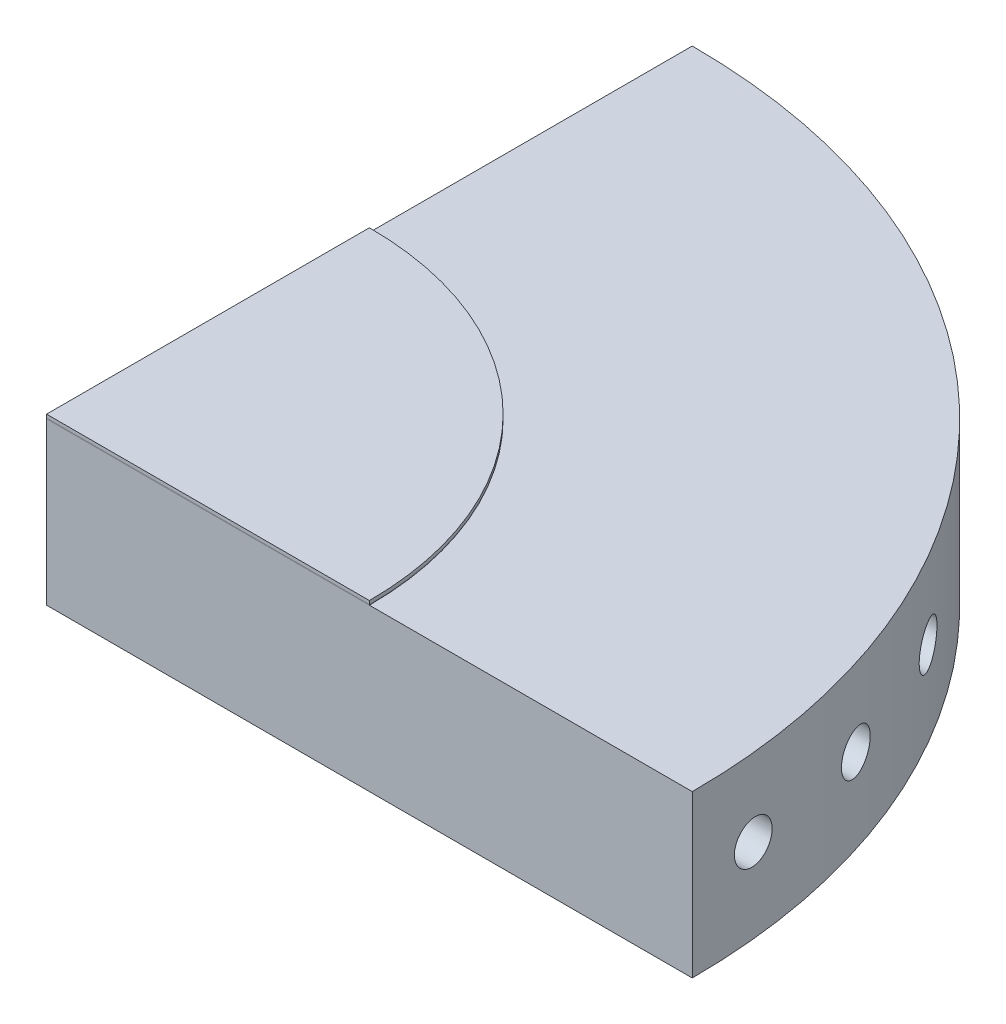
ISO-10303-21;
HEADER;
FILE_DESCRIPTION(('STEP AP214'),'2;1');
FILE_NAME('part.step','',(''),(''),'','','');
FILE_SCHEMA(('AUTOMOTIVE_DESIGN { 1 0 10303 214 1 1 1 1 }'));
ENDSEC;
DATA;
#1=APPLICATION_CONTEXT('core data for automotive mechanical design processes');
#2=APPLICATION_PROTOCOL_DEFINITION('international standard','automotive_design',2000,#1);
#3=PRODUCT_CONTEXT('',#1,'mechanical');
#4=PRODUCT('Part','Part','',(#3));
#5=PRODUCT_RELATED_PRODUCT_CATEGORY('part','',(#4));
#6=PRODUCT_DEFINITION_FORMATION('','',#4);
#7=PRODUCT_DEFINITION_CONTEXT('part definition',#1,'design');
#8=PRODUCT_DEFINITION('design','',#6,#7);
#9=PRODUCT_DEFINITION_SHAPE('','',#8);
#10=(LENGTH_UNIT() NAMED_UNIT(*) SI_UNIT(.MILLI.,.METRE.));
#11=(NAMED_UNIT(*) PLANE_ANGLE_UNIT() SI_UNIT($,.RADIAN.));
#12=(NAMED_UNIT(*) SI_UNIT($,.STERADIAN.) SOLID_ANGLE_UNIT());
#13=UNCERTAINTY_MEASURE_WITH_UNIT(LENGTH_MEASURE(1.E-05),#10,'distance_accuracy_value','');
#14=(GEOMETRIC_REPRESENTATION_CONTEXT(3) GLOBAL_UNCERTAINTY_ASSIGNED_CONTEXT((#13)) GLOBAL_UNIT_ASSIGNED_CONTEXT((#10,
#11,#12)) REPRESENTATION_CONTEXT('',''));
#15=CARTESIAN_POINT('',(0.,0.,0.));
#16=DIRECTION('',(0.,0.,1.));
#17=DIRECTION('',(1.,0.,0.));
#18=AXIS2_PLACEMENT_3D('',#15,#16,#17);
#19=CARTESIAN_POINT('',(0.,25.625,0.));
#20=DIRECTION('',(0.,-1.,0.));
#21=DIRECTION('',(0.,0.,-1.));
#22=AXIS2_PLACEMENT_3D('',#19,#20,#21);
#23=CYLINDRICAL_SURFACE('',#22,50.);
#24=DIRECTION('',(0.,-1.,0.));
#25=VECTOR('',#24,1.);
#26=CARTESIAN_POINT('',(0.,25.625,-50.));
#27=LINE('',#26,#25);
#28=CARTESIAN_POINT('',(0.,25.625,-50.));
#29=VERTEX_POINT('',#28);
#30=CARTESIAN_POINT('',(0.,25.1,-50.));
#31=VERTEX_POINT('',#30);
#32=EDGE_CURVE('E73',#29,#31,#27,.T.);
#33=ORIENTED_EDGE('',*,*,#32,.F.);
#34=CARTESIAN_POINT('',(0.,25.625,0.));
#35=DIRECTION('',(0.,1.,0.));
#36=DIRECTION('',(0.,0.,1.));
#37=AXIS2_PLACEMENT_3D('',#34,#35,#36);
#38=CIRCLE('',#37,50.);
#39=CARTESIAN_POINT('',(50.,25.625,0.));
#40=VERTEX_POINT('',#39);
#41=EDGE_CURVE('E98',#40,#29,#38,.T.);
#42=ORIENTED_EDGE('',*,*,#41,.F.);
#43=DIRECTION('',(0.,-1.,0.));
#44=VECTOR('',#43,1.);
#45=CARTESIAN_POINT('',(50.,25.625,0.));
#46=LINE('',#45,#44);
#47=CARTESIAN_POINT('',(50.,25.1,0.));
#48=VERTEX_POINT('',#47);
#49=EDGE_CURVE('E87',#48,#40,#46,.F.);
#50=ORIENTED_EDGE('',*,*,#49,.F.);
#51=CARTESIAN_POINT('',(0.,25.1,0.));
#52=DIRECTION('',(0.,1.,0.));
#53=DIRECTION('',(0.,0.,1.));
#54=AXIS2_PLACEMENT_3D('',#51,#52,#53);
#55=CIRCLE('',#54,50.);
#56=EDGE_CURVE('E103',#48,#31,#55,.T.);
#57=ORIENTED_EDGE('',*,*,#56,.T.);
#58=EDGE_LOOP('',(#33,#42,#50,#57));
#59=FACE_BOUND('',#58,.T.);
#60=ADVANCED_FACE('F53',(#59),#23,.T.);
#61=CARTESIAN_POINT('',(0.,25.625,0.));
#62=DIRECTION('',(0.,1.,0.));
#63=DIRECTION('',(0.,0.,1.));
#64=AXIS2_PLACEMENT_3D('',#61,#62,#63);
#65=PLANE('',#64);
#66=ORIENTED_EDGE('',*,*,#41,.T.);
#67=DIRECTION('',(0.,0.,-1.));
#68=VECTOR('',#67,1.);
#69=CARTESIAN_POINT('',(0.,25.625,0.));
#70=LINE('',#69,#68);
#71=CARTESIAN_POINT('',(0.,25.625,0.));
#72=VERTEX_POINT('',#71);
#73=EDGE_CURVE('E92',#72,#29,#70,.T.);
#74=ORIENTED_EDGE('',*,*,#73,.F.);
#75=DIRECTION('',(-1.,0.,0.));
#76=VECTOR('',#75,1.);
#77=CARTESIAN_POINT('',(0.,25.625,0.));
#78=LINE('',#77,#76);
#79=EDGE_CURVE('E84',#40,#72,#78,.T.);
#80=ORIENTED_EDGE('',*,*,#79,.F.);
#81=EDGE_LOOP('',(#66,#74,#80));
#82=FACE_BOUND('',#81,.T.);
#83=ADVANCED_FACE('F97',(#82),#65,.T.);
#84=CARTESIAN_POINT('',(0.,25.1,0.));
#85=DIRECTION('',(0.,1.,0.));
#86=DIRECTION('',(0.,0.,1.));
#87=AXIS2_PLACEMENT_3D('',#84,#85,#86);
#88=PLANE('',#87);
#89=DIRECTION('',(0.,0.,1.));
#90=VECTOR('',#89,1.);
#91=CARTESIAN_POINT('',(0.,25.1,0.));
#92=LINE('',#91,#90);
#93=CARTESIAN_POINT('',(0.,25.1,0.));
#94=VERTEX_POINT('',#93);
#95=EDGE_CURVE('E13',#31,#94,#92,.T.);
#96=ORIENTED_EDGE('',*,*,#95,.F.);
#97=ORIENTED_EDGE('',*,*,#56,.F.);
#98=DIRECTION('',(1.,0.,0.));
#99=VECTOR('',#98,1.);
#100=CARTESIAN_POINT('',(0.,25.1,0.));
#101=LINE('',#100,#99);
#102=EDGE_CURVE('E60',#94,#48,#101,.T.);
#103=ORIENTED_EDGE('',*,*,#102,.F.);
#104=EDGE_LOOP('',(#96,#97,#103));
#105=FACE_BOUND('',#104,.T.);
#106=ADVANCED_FACE('F109',(#105),#88,.F.);
#107=CARTESIAN_POINT('',(0.,25.625,0.));
#108=DIRECTION('',(-1.,0.,0.));
#109=DIRECTION('',(0.,0.,1.));
#110=AXIS2_PLACEMENT_3D('',#107,#108,#109);
#111=PLANE('',#110);
#112=ORIENTED_EDGE('',*,*,#32,.T.);
#113=ORIENTED_EDGE('',*,*,#95,.T.);
#114=DIRECTION('',(0.,-1.,0.));
#115=VECTOR('',#114,1.);
#116=CARTESIAN_POINT('',(0.,25.625,0.));
#117=LINE('',#116,#115);
#118=EDGE_CURVE('E67',#72,#94,#117,.T.);
#119=ORIENTED_EDGE('',*,*,#118,.F.);
#120=ORIENTED_EDGE('',*,*,#73,.T.);
#121=EDGE_LOOP('',(#112,#113,#119,#120));
#122=FACE_BOUND('',#121,.T.);
#123=ADVANCED_FACE('F94',(#122),#111,.T.);
#124=CARTESIAN_POINT('',(0.,25.625,0.));
#125=DIRECTION('',(0.,0.,1.));
#126=DIRECTION('',(1.,0.,0.));
#127=AXIS2_PLACEMENT_3D('',#124,#125,#126);
#128=PLANE('',#127);
#129=ORIENTED_EDGE('',*,*,#49,.T.);
#130=ORIENTED_EDGE('',*,*,#79,.T.);
#131=ORIENTED_EDGE('',*,*,#118,.T.);
#132=ORIENTED_EDGE('',*,*,#102,.T.);
#133=EDGE_LOOP('',(#129,#130,#131,#132));
#134=FACE_BOUND('',#133,.T.);
#135=ADVANCED_FACE('F85',(#134),#128,.T.);
#136=CLOSED_SHELL('',(#60,#83,#106,#123,#135));
#137=MANIFOLD_SOLID_BREP('B2',#136);
#138=CARTESIAN_POINT('',(0.,25.1,0.));
#139=DIRECTION('',(0.,-1.,0.));
#140=DIRECTION('',(0.,0.,-1.));
#141=AXIS2_PLACEMENT_3D('',#138,#139,#140);
#142=CYLINDRICAL_SURFACE('',#141,50.);
#143=DIRECTION('',(0.,-1.,0.));
#144=VECTOR('',#143,1.);
#145=CARTESIAN_POINT('',(0.,25.1,-50.));
#146=LINE('',#145,#144);
#147=CARTESIAN_POINT('',(0.,25.1,-50.));
#148=VERTEX_POINT('',#147);
#149=CARTESIAN_POINT('',(0.,25.,-50.));
#150=VERTEX_POINT('',#149);
#151=EDGE_CURVE('E198',#148,#150,#146,.T.);
#152=ORIENTED_EDGE('',*,*,#151,.F.);
#153=CARTESIAN_POINT('',(0.,25.1,0.));
#154=DIRECTION('',(0.,1.,0.));
#155=DIRECTION('',(0.,0.,1.));
#156=AXIS2_PLACEMENT_3D('',#153,#154,#155);
#157=CIRCLE('',#156,50.);
#158=CARTESIAN_POINT('',(50.,25.1,0.));
#159=VERTEX_POINT('',#158);
#160=EDGE_CURVE('E205',#159,#148,#157,.T.);
#161=ORIENTED_EDGE('',*,*,#160,.F.);
#162=DIRECTION('',(0.,-1.,0.));
#163=VECTOR('',#162,1.);
#164=CARTESIAN_POINT('',(50.,25.1,0.));
#165=LINE('',#164,#163);
#166=CARTESIAN_POINT('',(50.,25.,0.));
#167=VERTEX_POINT('',#166);
#168=EDGE_CURVE('E194',#167,#159,#165,.F.);
#169=ORIENTED_EDGE('',*,*,#168,.F.);
#170=CARTESIAN_POINT('',(0.,25.,0.));
#171=DIRECTION('',(0.,1.,0.));
#172=DIRECTION('',(0.,0.,1.));
#173=AXIS2_PLACEMENT_3D('',#170,#171,#172);
#174=CIRCLE('',#173,50.);
#175=EDGE_CURVE('E206',#167,#150,#174,.T.);
#176=ORIENTED_EDGE('',*,*,#175,.T.);
#177=EDGE_LOOP('',(#152,#161,#169,#176));
#178=FACE_BOUND('',#177,.T.);
#179=ADVANCED_FACE('F160',(#178),#142,.T.);
#180=CARTESIAN_POINT('',(0.,25.1,0.));
#181=DIRECTION('',(0.,1.,0.));
#182=DIRECTION('',(0.,0.,1.));
#183=AXIS2_PLACEMENT_3D('',#180,#181,#182);
#184=PLANE('',#183);
#185=ORIENTED_EDGE('',*,*,#160,.T.);
#186=DIRECTION('',(0.,0.,1.));
#187=VECTOR('',#186,1.);
#188=CARTESIAN_POINT('',(0.,25.1,0.));
#189=LINE('',#188,#187);
#190=CARTESIAN_POINT('',(0.,25.1,0.));
#191=VERTEX_POINT('',#190);
#192=EDGE_CURVE('E180',#148,#191,#189,.T.);
#193=ORIENTED_EDGE('',*,*,#192,.T.);
#194=DIRECTION('',(1.,0.,0.));
#195=VECTOR('',#194,1.);
#196=CARTESIAN_POINT('',(0.,25.1,0.));
#197=LINE('',#196,#195);
#198=EDGE_CURVE('E191',#191,#159,#197,.T.);
#199=ORIENTED_EDGE('',*,*,#198,.T.);
#200=EDGE_LOOP('',(#185,#193,#199));
#201=FACE_BOUND('',#200,.T.);
#202=ADVANCED_FACE('F204',(#201),#184,.T.);
#203=CARTESIAN_POINT('',(0.,25.,0.));
#204=DIRECTION('',(0.,1.,0.));
#205=DIRECTION('',(0.,0.,1.));
#206=AXIS2_PLACEMENT_3D('',#203,#204,#205);
#207=PLANE('',#206);
#208=DIRECTION('',(0.,0.,1.));
#209=VECTOR('',#208,1.);
#210=CARTESIAN_POINT('',(0.,25.,0.));
#211=LINE('',#210,#209);
#212=CARTESIAN_POINT('',(0.,25.,0.));
#213=VERTEX_POINT('',#212);
#214=EDGE_CURVE('E51',#150,#213,#211,.T.);
#215=ORIENTED_EDGE('',*,*,#214,.F.);
#216=ORIENTED_EDGE('',*,*,#175,.F.);
#217=DIRECTION('',(1.,0.,0.));
#218=VECTOR('',#217,1.);
#219=CARTESIAN_POINT('',(0.,25.,0.));
#220=LINE('',#219,#218);
#221=EDGE_CURVE('E167',#213,#167,#220,.T.);
#222=ORIENTED_EDGE('',*,*,#221,.F.);
#223=EDGE_LOOP('',(#215,#216,#222));
#224=FACE_BOUND('',#223,.T.);
#225=ADVANCED_FACE('F216',(#224),#207,.F.);
#226=CARTESIAN_POINT('',(0.,25.625,0.));
#227=DIRECTION('',(-1.,0.,0.));
#228=DIRECTION('',(0.,0.,1.));
#229=AXIS2_PLACEMENT_3D('',#226,#227,#228);
#230=PLANE('',#229);
#231=ORIENTED_EDGE('',*,*,#151,.T.);
#232=ORIENTED_EDGE('',*,*,#214,.T.);
#233=DIRECTION('',(0.,-1.,0.));
#234=VECTOR('',#233,1.);
#235=CARTESIAN_POINT('',(0.,25.625,0.));
#236=LINE('',#235,#234);
#237=EDGE_CURVE('E174',#191,#213,#236,.T.);
#238=ORIENTED_EDGE('',*,*,#237,.F.);
#239=ORIENTED_EDGE('',*,*,#192,.F.);
#240=EDGE_LOOP('',(#231,#232,#238,#239));
#241=FACE_BOUND('',#240,.T.);
#242=ADVANCED_FACE('F200',(#241),#230,.T.);
#243=CARTESIAN_POINT('',(0.,25.625,0.));
#244=DIRECTION('',(0.,0.,1.));
#245=DIRECTION('',(1.,0.,0.));
#246=AXIS2_PLACEMENT_3D('',#243,#244,#245);
#247=PLANE('',#246);
#248=ORIENTED_EDGE('',*,*,#237,.T.);
#249=ORIENTED_EDGE('',*,*,#221,.T.);
#250=ORIENTED_EDGE('',*,*,#168,.T.);
#251=ORIENTED_EDGE('',*,*,#198,.F.);
#252=EDGE_LOOP('',(#248,#249,#250,#251));
#253=FACE_BOUND('',#252,.T.);
#254=ADVANCED_FACE('F192',(#253),#247,.T.);
#255=CLOSED_SHELL('',(#179,#202,#225,#242,#254));
#256=MANIFOLD_SOLID_BREP('B7',#255);
#257=CARTESIAN_POINT('',(0.,0.,0.));
#258=DIRECTION('',(0.,1.,0.));
#259=DIRECTION('',(0.,0.,1.));
#260=AXIS2_PLACEMENT_3D('',#257,#258,#259);
#261=PLANE('',#260);
#262=CARTESIAN_POINT('',(25.,0.,-25.));
#263=DIRECTION('',(0.,1.,0.));
#264=DIRECTION('',(0.,0.,1.));
#265=AXIS2_PLACEMENT_3D('',#262,#263,#264);
#266=CIRCLE('',#265,3.);
#267=CARTESIAN_POINT('',(25.,0.,-22.));
#268=VERTEX_POINT('',#267);
#269=EDGE_CURVE('E268',#268,#268,#266,.F.);
#270=ORIENTED_EDGE('',*,*,#269,.F.);
#271=EDGE_LOOP('',(#270));
#272=FACE_BOUND('',#271,.T.);
#273=CARTESIAN_POINT('',(60.,0.,-60.));
#274=DIRECTION('',(0.,-1.,0.));
#275=DIRECTION('',(0.,0.,-1.));
#276=AXIS2_PLACEMENT_3D('',#273,#274,#275);
#277=CIRCLE('',#276,1.5);
#278=CARTESIAN_POINT('',(60.,0.,-61.5));
#279=VERTEX_POINT('',#278);
#280=EDGE_CURVE('E326',#279,#279,#277,.T.);
#281=ORIENTED_EDGE('',*,*,#280,.F.);
#282=EDGE_LOOP('',(#281));
#283=FACE_BOUND('',#282,.T.);
#284=CARTESIAN_POINT('',(15.,0.,-20.));
#285=DIRECTION('',(0.,-1.,0.));
#286=DIRECTION('',(0.,0.,-1.));
#287=AXIS2_PLACEMENT_3D('',#284,#285,#286);
#288=CIRCLE('',#287,1.5);
#289=CARTESIAN_POINT('',(15.,0.,-21.5));
#290=VERTEX_POINT('',#289);
#291=EDGE_CURVE('E332',#290,#290,#288,.T.);
#292=ORIENTED_EDGE('',*,*,#291,.F.);
#293=EDGE_LOOP('',(#292));
#294=FACE_BOUND('',#293,.T.);
#295=DIRECTION('',(0.,0.,1.));
#296=VECTOR('',#295,1.);
#297=CARTESIAN_POINT('',(0.,0.,0.));
#298=LINE('',#297,#296);
#299=CARTESIAN_POINT('',(0.,0.,-100.));
#300=VERTEX_POINT('',#299);
#301=CARTESIAN_POINT('',(0.,0.,0.));
#302=VERTEX_POINT('',#301);
#303=EDGE_CURVE('E302',#300,#302,#298,.T.);
#304=ORIENTED_EDGE('',*,*,#303,.F.);
#305=CARTESIAN_POINT('',(0.,0.,0.));
#306=DIRECTION('',(0.,1.,0.));
#307=DIRECTION('',(0.,0.,1.));
#308=AXIS2_PLACEMENT_3D('',#305,#306,#307);
#309=CIRCLE('',#308,100.);
#310=CARTESIAN_POINT('',(100.,0.,0.));
#311=VERTEX_POINT('',#310);
#312=EDGE_CURVE('E345',#311,#300,#309,.T.);
#313=ORIENTED_EDGE('',*,*,#312,.F.);
#314=DIRECTION('',(1.,0.,0.));
#315=VECTOR('',#314,1.);
#316=CARTESIAN_POINT('',(0.,0.,0.));
#317=LINE('',#316,#315);
#318=EDGE_CURVE('E279',#302,#311,#317,.T.);
#319=ORIENTED_EDGE('',*,*,#318,.F.);
#320=EDGE_LOOP('',(#304,#313,#319));
#321=FACE_BOUND('',#320,.T.);
#322=ADVANCED_FACE('F258',(#272,#283,#294,#321),#261,.F.);
#323=CARTESIAN_POINT('',(0.,25.,0.));
#324=DIRECTION('',(0.,-1.,0.));
#325=DIRECTION('',(0.,0.,-1.));
#326=AXIS2_PLACEMENT_3D('',#323,#324,#325);
#327=CYLINDRICAL_SURFACE('',#326,100.);
#328=CARTESIAN_POINT('',(84.6430003012653,13.,-53.25));
#329=CARTESIAN_POINT('',(84.6430072284339,12.8373842190232,-53.2499897010057));
#330=CARTESIAN_POINT('',(84.6507284157479,12.6746574705549,-53.2377219593748));
#331=CARTESIAN_POINT('',(84.6811522808291,12.3541592349469,-53.1893149271213));
#332=CARTESIAN_POINT('',(84.7038710966063,12.1963932775946,-53.1531499221071));
#333=CARTESIAN_POINT('',(84.7628433859388,11.8908866319887,-53.0590559808106));
#334=CARTESIAN_POINT('',(84.7990465327191,11.7431110504471,-53.0012079657173));
#335=CARTESIAN_POINT('',(84.8831561739674,11.4602489739724,-52.8663984330452));
#336=CARTESIAN_POINT('',(84.9310635202516,11.3251634035928,-52.7894355243027));
#337=CARTESIAN_POINT('',(85.0397994853008,11.0620997077621,-52.6141021887207));
#338=CARTESIAN_POINT('',(85.1012378116995,10.9350570343434,-52.514712667346));
#339=CARTESIAN_POINT('',(85.2327225875308,10.6993353786383,-52.301039654164));
#340=CARTESIAN_POINT('',(85.3027726639042,10.5906641797964,-52.1867498857066));
#341=CARTESIAN_POINT('',(85.460145922568,10.3780712156738,-51.9286958655135));
#342=CARTESIAN_POINT('',(85.548496425467,10.2771748343114,-51.7830662180488));
#343=CARTESIAN_POINT('',(85.7310564131308,10.1013756620005,-51.4802611517311));
#344=CARTESIAN_POINT('',(85.8252693084436,10.0264881720781,-51.3230790021949));
#345=CARTESIAN_POINT('',(86.0304947669392,9.89455972837199,-50.9784214749552));
#346=CARTESIAN_POINT('',(86.1420304479601,9.84141212717866,-50.7897604965152));
#347=CARTESIAN_POINT('',(86.36666022504,9.76967944113553,-50.4068384698725));
#348=CARTESIAN_POINT('',(86.4797550505472,9.75111112809748,-50.2125747505632));
#349=CARTESIAN_POINT('',(86.7133886792268,9.74890495039734,-49.8080993446905));
#350=CARTESIAN_POINT('',(86.833832397913,9.76805820445286,-49.5978082786841));
#351=CARTESIAN_POINT('',(87.0698786454187,9.84745008116434,-49.1822468203919));
#352=CARTESIAN_POINT('',(87.1854804440999,9.90769487672179,-48.9769771872416));
#353=CARTESIAN_POINT('',(87.406156214959,10.068055008455,-48.5820328163621));
#354=CARTESIAN_POINT('',(87.5113901841584,10.1673793032116,-48.3921337218698));
#355=CARTESIAN_POINT('',(87.6601633204762,10.3454721688006,-48.1217881810942));
#356=CARTESIAN_POINT('',(87.7082599924385,10.4097211875583,-48.0340558238523));
#357=CARTESIAN_POINT('',(87.8009459256064,10.5477059506357,-47.864425071719));
#358=CARTESIAN_POINT('',(87.8455374622492,10.6214354571485,-47.7825228953505));
#359=CARTESIAN_POINT('',(87.9262511420874,10.769853707469,-47.6338195904803));
#360=CARTESIAN_POINT('',(87.9627716472129,10.843642168366,-47.566334173279));
#361=CARTESIAN_POINT('',(88.0321750902419,10.9981168883464,-47.4377642798229));
#362=CARTESIAN_POINT('',(88.0650601917442,11.0787989934507,-47.3766759974879));
#363=CARTESIAN_POINT('',(88.1268046380238,11.2465246657755,-47.2617240735756));
#364=CARTESIAN_POINT('',(88.1556664428424,11.3335642956295,-47.2078560179792));
#365=CARTESIAN_POINT('',(88.2090076047846,11.5133775216882,-47.1081116019087));
#366=CARTESIAN_POINT('',(88.233487665936,11.6061501935198,-47.0622339576232));
#367=CARTESIAN_POINT('',(88.2747463477743,11.7838093953075,-46.9847934539395));
#368=CARTESIAN_POINT('',(88.292117668155,11.8680827884294,-46.9521357133495));
#369=CARTESIAN_POINT('',(88.3231152090456,12.0396734501454,-46.8937992851166));
#370=CARTESIAN_POINT('',(88.3367419449532,12.1269902979778,-46.8681196370273));
#371=CARTESIAN_POINT('',(88.3600780930231,12.3039252717314,-46.8241094365723));
#372=CARTESIAN_POINT('',(88.3697896924131,12.3935420829069,-46.8057747808935));
#373=CARTESIAN_POINT('',(88.385184845448,12.5743105297784,-46.7766967408821));
#374=CARTESIAN_POINT('',(88.3908686726894,12.6654620607941,-46.7659528409286));
#375=CARTESIAN_POINT('',(88.4010459460142,12.9223294402922,-46.746714993767));
#376=CARTESIAN_POINT('',(88.4008976992403,13.0889998796525,-46.7469949029563));
#377=CARTESIAN_POINT('',(88.3871732630372,13.419663464497,-46.7729386170689));
#378=CARTESIAN_POINT('',(88.3735998296717,13.583657152469,-46.7985972119881));
#379=CARTESIAN_POINT('',(88.3340768524008,13.9006889906618,-46.8731541529366));
#380=CARTESIAN_POINT('',(88.3084162325865,14.053891594354,-46.9215098713979));
#381=CARTESIAN_POINT('',(88.2458056842694,14.3495315475952,-47.039155959437));
#382=CARTESIAN_POINT('',(88.2088541451693,14.491967357693,-47.1084493156559));
#383=CARTESIAN_POINT('',(88.1228549743442,14.7697035472706,-47.2691347526858));
#384=CARTESIAN_POINT('',(88.0733061945815,14.9043193445127,-47.3614381677809));
#385=CARTESIAN_POINT('',(87.96473729833,15.1560305667576,-47.5627802550878));
#386=CARTESIAN_POINT('',(87.9057138716905,15.2731198408015,-47.6718247755453));
#387=CARTESIAN_POINT('',(87.7735166185664,15.4989456992062,-47.9148277277081));
#388=CARTESIAN_POINT('',(87.6995191210777,15.6056912811148,-48.0501855962568));
#389=CARTESIAN_POINT('',(87.5440260008425,15.7950453955821,-48.3329036524889));
#390=CARTESIAN_POINT('',(87.462526945646,15.8776428058698,-48.480269330951));
#391=CARTESIAN_POINT('',(87.2836140930681,16.0268352884998,-48.8017260264328));
#392=CARTESIAN_POINT('',(87.1854710477101,16.0902549191439,-48.9768857292967));
#393=CARTESIAN_POINT('',(86.9845203623647,16.1861435590665,-49.3329006212346));
#394=CARTESIAN_POINT('',(86.8817104613717,16.2185973946565,-49.5137585577331));
#395=CARTESIAN_POINT('',(86.6625456737034,16.2546194127317,-49.8964604597523));
#396=CARTESIAN_POINT('',(86.5459183137563,16.2547262427431,-50.0984797705365));
#397=CARTESIAN_POINT('',(86.3127206628006,16.217737913467,-50.4991888467591));
#398=CARTESIAN_POINT('',(86.19615041734,16.180626889122,-50.6978771555502));
#399=CARTESIAN_POINT('',(85.9608850607657,16.0669937425218,-51.095812429107));
#400=CARTESIAN_POINT('',(85.8423428789216,15.9887205621968,-51.2946564124121));
#401=CARTESIAN_POINT('',(85.6129059452277,15.7923793198032,-51.6766874201455));
#402=CARTESIAN_POINT('',(85.502012648369,15.6743037114215,-51.8598714672771));
#403=CARTESIAN_POINT('',(85.2983404360121,15.4065481234719,-52.1941505666104));
#404=CARTESIAN_POINT('',(85.2049121896776,15.2588801902272,-52.3464333021145));
#405=CARTESIAN_POINT('',(85.0772439833073,15.013375477244,-52.5534890335543));
#406=CARTESIAN_POINT('',(85.0367745175325,14.9275617452912,-52.6189340963578));
#407=CARTESIAN_POINT('',(84.960636296065,14.7484050776601,-52.7417811474917));
#408=CARTESIAN_POINT('',(84.92496547802,14.6550654042281,-52.7991865915102));
#409=CARTESIAN_POINT('',(84.8447762708106,14.4193055739713,-52.9279884176772));
#410=CARTESIAN_POINT('',(84.8031678480354,14.2732104268183,-52.9945939728415));
#411=CARTESIAN_POINT('',(84.7334361714243,13.970120064358,-53.1060181726724));
#412=CARTESIAN_POINT('',(84.7052878769507,13.8131457163289,-53.1508772756526));
#413=CARTESIAN_POINT('',(84.6708855390392,13.5460620941783,-53.2056555522214));
#414=CARTESIAN_POINT('',(84.6604590353005,13.4378092827622,-53.2222401856972));
#415=CARTESIAN_POINT('',(84.6465134625819,13.2197213894099,-53.2444168653999));
#416=CARTESIAN_POINT('',(84.6429956202987,13.1098860299647,-53.2500069594451));
#417=CARTESIAN_POINT('',(84.6430003012653,13.,-53.25));
#418=B_SPLINE_CURVE_WITH_KNOTS('',3,(#328,#329,#330,#331,#332,#333,#334,#335,#336,#337,#338,
#339,#340,#341,#342,#343,#344,#345,#346,#347,#348,#349,#350,#351,#352,#353,#354,#355,#356,#357,
#358,#359,#360,#361,#362,#363,#364,#365,#366,#367,#368,#369,#370,#371,#372,#373,#374,#375,#376,
#377,#378,#379,#380,#381,#382,#383,#384,#385,#386,#387,#388,#389,#390,#391,#392,#393,#394,#395,
#396,#397,#398,#399,#400,#401,#402,#403,#404,#405,#406,#407,#408,#409,#410,#411,#412,#413,#414,
#415,#416,#417),.UNSPECIFIED.,.T.,.F.,(4,2,2,2,2,2,2,2,2,2,2,2,2,2,2,2,2,2,2,2,2,2,2,2,2,2,2,2,
2,2,2,2,2,2,2,2,2,2,2,2,2,2,2,2,4),(0.,0.487412816911405,0.975350965041686,1.46148596685246,
1.94765635947498,2.46346757124121,2.97949677208202,3.57108564897354,4.16302197030096,
4.83671270061982,5.51073010262188,6.23649312958122,6.96236520697999,7.67424344621114,
8.03048693213856,8.38649721119285,8.70541553865753,9.02414302930939,9.34267477136168,
9.66115528793483,9.93688346752249,10.2125736773598,10.4881096561228,10.7636269166228,
11.2609402042731,11.7581514193962,12.2440379746855,12.7299938718169,13.2395990049779,
13.749382567579,14.3099008148981,14.87067682292,15.4997709421158,16.1291731684814,
16.8259042817274,17.5229325206356,18.2523470906235,18.9819000313011,19.6726983906945,
20.0179448186667,20.3630423900899,20.8583949649896,21.3528223873369,21.682128384469,
22.0114928476383),.UNSPECIFIED.);
#419=CARTESIAN_POINT('',(84.6430003012653,13.,-53.25));
#420=VERTEX_POINT('',#419);
#421=EDGE_CURVE('E331',#420,#420,#418,.T.);
#422=ORIENTED_EDGE('',*,*,#421,.T.);
#423=EDGE_LOOP('',(#422));
#424=FACE_BOUND('',#423,.T.);
#425=CARTESIAN_POINT('',(94.3103255216522,13.,-33.25));
#426=CARTESIAN_POINT('',(94.3103299829073,12.8248992013804,-33.2499887620633));
#427=CARTESIAN_POINT('',(94.3153406220496,12.6496545095973,-33.2357857789402));
#428=CARTESIAN_POINT('',(94.3351673894924,12.3041478689976,-33.1794671936887));
#429=CARTESIAN_POINT('',(94.3499958447548,12.1338924655785,-33.1373165011408));
#430=CARTESIAN_POINT('',(94.3887488102149,11.8035739338139,-33.0267694228832));
#431=CARTESIAN_POINT('',(94.4126572894061,11.6434934195975,-32.9584192909653));
#432=CARTESIAN_POINT('',(94.4685472149277,11.3373931787316,-32.7978776318679));
#433=CARTESIAN_POINT('',(94.5005275701408,11.1913715553515,-32.7056893269768));
#434=CARTESIAN_POINT('',(94.5722336103193,10.9132414310099,-32.4977690589181));
#435=CARTESIAN_POINT('',(94.6121365936477,10.7815847206572,-32.3814948668424));
#436=CARTESIAN_POINT('',(94.6976852095961,10.539491272057,-32.1304526222269));
#437=CARTESIAN_POINT('',(94.7433322827615,10.4290598744704,-31.9956799297242));
#438=CARTESIAN_POINT('',(94.8414349432328,10.2263750093124,-31.7037399629904));
#439=CARTESIAN_POINT('',(94.8941234939499,10.1354002759513,-31.5457629727991));
#440=CARTESIAN_POINT('',(95.002544022954,9.98130782972163,-31.2177269395472));
#441=CARTESIAN_POINT('',(95.058276748836,9.91819699460708,-31.0476649255059));
#442=CARTESIAN_POINT('',(95.1736839633603,9.81895958234089,-30.6921211575523));
#443=CARTESIAN_POINT('',(95.2334235604482,9.78415670075149,-30.5062900093395));
#444=CARTESIAN_POINT('',(95.3527205526102,9.7471932668057,-30.1313358686524));
#445=CARTESIAN_POINT('',(95.4122779225347,9.74503703340972,-29.9422124439426));
#446=CARTESIAN_POINT('',(95.530535753027,9.77383972333168,-29.5627614297387));
#447=CARTESIAN_POINT('',(95.5892059503539,9.80534457175338,-29.372465299382));
#448=CARTESIAN_POINT('',(95.7030317503422,9.90185631519882,-28.9994440017647));
#449=CARTESIAN_POINT('',(95.758187508115,9.96686173050686,-28.8167185004954));
#450=CARTESIAN_POINT('',(95.8626276127349,10.1277454196102,-28.4673387906882));
#451=CARTESIAN_POINT('',(95.9119912873133,10.2231170509377,-28.3004754522151));
#452=CARTESIAN_POINT('',(96.0045016637371,10.4427816684815,-27.9850442964627));
#453=CARTESIAN_POINT('',(96.0476496238202,10.5670687880207,-27.8364727772854));
#454=CARTESIAN_POINT('',(96.1250747878319,10.8361694053982,-27.567895421335));
#455=CARTESIAN_POINT('',(96.1596211713022,10.9800531152402,-27.4470359524103));
#456=CARTESIAN_POINT('',(96.2209292117403,11.2876253768976,-27.2313311991206));
#457=CARTESIAN_POINT('',(96.2476927703244,11.4513090770199,-27.1364795604573));
#458=CARTESIAN_POINT('',(96.2918143374794,11.7867627721908,-26.9794904568355));
#459=CARTESIAN_POINT('',(96.3095052621517,11.9579488322456,-26.916197862311));
#460=CARTESIAN_POINT('',(96.3365983545161,12.3091051199681,-26.819067665927));
#461=CARTESIAN_POINT('',(96.3460020363742,12.4890737366265,-26.7852246833299));
#462=CARTESIAN_POINT('',(96.3561388412762,12.8473337137816,-26.7487355803228));
#463=CARTESIAN_POINT('',(96.3571046528639,13.0255337212912,-26.7452522477659));
#464=CARTESIAN_POINT('',(96.3509521443517,13.3799630538377,-26.7674083618331));
#465=CARTESIAN_POINT('',(96.3438344250956,13.5561925243602,-26.79304564394));
#466=CARTESIAN_POINT('',(96.3217745549731,13.900318143838,-26.872242176049));
#467=CARTESIAN_POINT('',(96.3068922271771,14.0682674087147,-26.9255879300465));
#468=CARTESIAN_POINT('',(96.2696947027637,14.3926620574724,-27.0582815724655));
#469=CARTESIAN_POINT('',(96.2473792345982,14.5491070208224,-27.1376304108321));
#470=CARTESIAN_POINT('',(96.195486289092,14.848441942354,-27.3210099478105));
#471=CARTESIAN_POINT('',(96.1658141231156,14.9911184751406,-27.4253618219911));
#472=CARTESIAN_POINT('',(96.1000674747009,15.2569136689832,-27.6548594323956));
#473=CARTESIAN_POINT('',(96.0639921710146,15.3800298174371,-27.7800078357914));
#474=CARTESIAN_POINT('',(95.9850637190254,15.6073459294965,-28.0515257953645));
#475=CARTESIAN_POINT('',(95.9420357608454,15.7108448823245,-28.1984310570815));
#476=CARTESIAN_POINT('',(95.8510754544002,15.8918157247228,-28.5060880783493));
#477=CARTESIAN_POINT('',(95.8031422002698,15.9692827956058,-28.6668423945473));
#478=CARTESIAN_POINT('',(95.7015186255705,16.0992131250882,-29.0043369348818));
#479=CARTESIAN_POINT('',(95.6476757497639,16.1505688282915,-29.1814576835963));
#480=CARTESIAN_POINT('',(95.5372431421986,16.222647019207,-29.5409978873356));
#481=CARTESIAN_POINT('',(95.4806528619144,16.2433633635093,-29.723418397526));
#482=CARTESIAN_POINT('',(95.3641697985792,16.2541053491948,-30.0950879851887));
#483=CARTESIAN_POINT('',(95.3042305375956,16.2430421555275,-30.2843545584546));
#484=CARTESIAN_POINT('',(95.1846247039833,16.1882543169647,-30.6582088004996));
#485=CARTESIAN_POINT('',(95.1249581693384,16.1445252540978,-30.8427958328914));
#486=CARTESIAN_POINT('',(95.0068827509635,16.0245956861161,-31.2046301819489));
#487=CARTESIAN_POINT('',(94.9485020712744,15.947960962122,-31.3817432623926));
#488=CARTESIAN_POINT('',(94.8358247745997,15.7638943700403,-31.7206281959261));
#489=CARTESIAN_POINT('',(94.7815278347639,15.656464939743,-31.8824012620235));
#490=CARTESIAN_POINT('',(94.6800711774668,15.4157306335771,-32.1824292434175));
#491=CARTESIAN_POINT('',(94.6327923159056,15.2829748670444,-32.3210833561229));
#492=CARTESIAN_POINT('',(94.5460764635072,14.9936340290006,-32.5738749021324));
#493=CARTESIAN_POINT('',(94.5066392555041,14.8370496176094,-32.6880130143868));
#494=CARTESIAN_POINT('',(94.4391182792933,14.5123908630703,-32.8825652070946));
#495=CARTESIAN_POINT('',(94.4105788985765,14.3452341136122,-32.9643396120729));
#496=CARTESIAN_POINT('',(94.3754011248134,14.0852665038161,-33.0648589336491));
#497=CARTESIAN_POINT('',(94.3649488936256,13.997097181741,-33.0946698807311));
#498=CARTESIAN_POINT('',(94.3466940058106,13.8182838229286,-33.1466754724083));
#499=CARTESIAN_POINT('',(94.338890423403,13.7276406628634,-33.1688727782228));
#500=CARTESIAN_POINT('',(94.3251277642703,13.5316296845935,-33.2079925504136));
#501=CARTESIAN_POINT('',(94.3195856340358,13.42599240866,-33.2237250320039));
#502=CARTESIAN_POINT('',(94.3121831998454,13.2135879194671,-33.2447320485533));
#503=CARTESIAN_POINT('',(94.3103228000509,13.1068207356929,-33.2500068557349));
#504=CARTESIAN_POINT('',(94.3103255216522,13.,-33.25));
#505=B_SPLINE_CURVE_WITH_KNOTS('',3,(#425,#426,#427,#428,#429,#430,#431,#432,#433,#434,#435,
#436,#437,#438,#439,#440,#441,#442,#443,#444,#445,#446,#447,#448,#449,#450,#451,#452,#453,#454,
#455,#456,#457,#458,#459,#460,#461,#462,#463,#464,#465,#466,#467,#468,#469,#470,#471,#472,#473,
#474,#475,#476,#477,#478,#479,#480,#481,#482,#483,#484,#485,#486,#487,#488,#489,#490,#491,#492,
#493,#494,#495,#496,#497,#498,#499,#500,#501,#502,#503,#504),.UNSPECIFIED.,.T.,.F.,(4,2,2,2,2,2,
2,2,2,2,2,2,2,2,2,2,2,2,2,2,2,2,2,2,2,2,2,2,2,2,2,2,2,2,2,2,2,2,2,4),(0.,0.524914716509305,
1.0504897535497,1.57514115636454,2.09972167727139,2.63772944701436,3.17587241223645,
3.74262877542978,4.30952495518907,4.90161185647439,5.49377708670563,6.0956940929353,
6.69758451484728,7.28991712200948,7.88212965517118,8.45242707841646,9.02258504075729,
9.56997467855828,10.1172642818038,10.6494121335618,11.1815204336896,11.7095883148405,
12.2376754895265,12.7729488380732,13.3082908889219,13.8601537757483,14.4121187601354,
14.9858692784112,15.5597348221704,16.1534942685691,16.7473340338856,17.3492632213445,
17.9511447716507,18.5412158310694,19.1312705468508,19.6928847183035,19.9735388120067,
20.2540947076238,20.57432874591,20.894554448109),.UNSPECIFIED.);
#506=CARTESIAN_POINT('',(94.3103255216522,13.,-33.25));
#507=VERTEX_POINT('',#506);
#508=EDGE_CURVE('E357',#507,#507,#505,.T.);
#509=ORIENTED_EDGE('',*,*,#508,.T.);
#510=EDGE_LOOP('',(#509));
#511=FACE_BOUND('',#510,.T.);
#512=CARTESIAN_POINT('',(99.118300530225,13.,-13.25));
#513=CARTESIAN_POINT('',(99.1183020803645,12.8185588717621,-13.2499917733685));
#514=CARTESIAN_POINT('',(99.1203424889673,12.6369866933682,-13.2347525391533));
#515=CARTESIAN_POINT('',(99.128408804876,12.2788697876261,-13.1741969040053));
#516=CARTESIAN_POINT('',(99.1344394787154,12.1023313366691,-13.1288445314815));
#517=CARTESIAN_POINT('',(99.1501805460007,11.7595455927866,-13.0094312663508));
#518=CARTESIAN_POINT('',(99.1598883915822,11.5932912667028,-12.9353902509184));
#519=CARTESIAN_POINT('',(99.1825084174775,11.2756478990345,-12.760788999279));
#520=CARTESIAN_POINT('',(99.1954198863351,11.1242555673237,-12.660234650805));
#521=CARTESIAN_POINT('',(99.2239092309675,10.8398081871671,-12.4349806811204));
#522=CARTESIAN_POINT('',(99.2394989324527,10.706839404875,-12.3101736373661));
#523=CARTESIAN_POINT('',(99.2726077926049,10.4636936227271,-12.0402572336218));
#524=CARTESIAN_POINT('',(99.290127101671,10.3535184013954,-11.8951462908496));
#525=CARTESIAN_POINT('',(99.3265022641717,10.1582034500953,-11.5874970910731));
#526=CARTESIAN_POINT('',(99.3453674519917,10.0732650766345,-11.4248320829987));
#527=CARTESIAN_POINT('',(99.3835702897435,9.93192734790067,-11.0875934648103));
#528=CARTESIAN_POINT('',(99.4029079530888,9.87552880385551,-10.9130195163517));
#529=CARTESIAN_POINT('',(99.4414524636032,9.79265648637208,-10.55603567848));
#530=CARTESIAN_POINT('',(99.4606583041383,9.76632113535202,-10.3735935247134));
#531=CARTESIAN_POINT('',(99.4982313743993,9.74481880172372,-10.0067945452844));
#532=CARTESIAN_POINT('',(99.516598604508,9.74965180488304,-9.82243772049626));
#533=CARTESIAN_POINT('',(99.5519770587267,9.79039508183928,-9.45714172021304));
#534=CARTESIAN_POINT('',(99.568988904763,9.82629101148119,-9.27620100663664));
#535=CARTESIAN_POINT('',(99.6012772064201,9.92818682742102,-8.92284010007737));
#536=CARTESIAN_POINT('',(99.6165536916738,9.99418619957559,-8.75041976162886));
#537=CARTESIAN_POINT('',(99.6450505892996,10.1541656542419,-8.41970136497272));
#538=CARTESIAN_POINT('',(99.6582784384827,10.2480407407252,-8.2613531604024));
#539=CARTESIAN_POINT('',(99.6825905180626,10.4612339232569,-7.96264029578559));
#540=CARTESIAN_POINT('',(99.6936747956885,10.5805514586129,-7.82227523954134));
#541=CARTESIAN_POINT('',(99.7135927389075,10.84071505429,-7.56413611332075));
#542=CARTESIAN_POINT('',(99.72243539443,10.9814713759201,-7.44627228865587));
#543=CARTESIAN_POINT('',(99.7379256543534,11.2808753708173,-7.2358382654812));
#544=CARTESIAN_POINT('',(99.7445732924759,11.4395227691773,-7.14326767840055));
#545=CARTESIAN_POINT('',(99.7556890950397,11.7697275049505,-6.98632209570292));
#546=CARTESIAN_POINT('',(99.7601632599921,11.9412477720237,-6.92186952284973));
#547=CARTESIAN_POINT('',(99.7669985595733,12.2927088833872,-6.82264561144674));
#548=CARTESIAN_POINT('',(99.7693597119029,12.4726496571243,-6.78787402425512));
#549=CARTESIAN_POINT('',(99.7719941949558,12.8355854397345,-6.74904146623451));
#550=CARTESIAN_POINT('',(99.7722703162142,13.0185760377678,-6.74493944836205));
#551=CARTESIAN_POINT('',(99.7707455535046,13.3826482129808,-6.76745551583208));
#552=CARTESIAN_POINT('',(99.7689446769359,13.563729796959,-6.79407349173591));
#553=CARTESIAN_POINT('',(99.7632454742537,13.9187873572458,-6.87725027302386));
#554=CARTESIAN_POINT('',(99.7593477878987,14.0927654834825,-6.93379994585101));
#555=CARTESIAN_POINT('',(99.7494182255633,14.4287431404937,-7.07520729341112));
#556=CARTESIAN_POINT('',(99.7433863503904,14.5907426758011,-7.16006495743136));
#557=CARTESIAN_POINT('',(99.7291492074609,14.8982705845611,-7.35570433265213));
#558=CARTESIAN_POINT('',(99.7209427086083,15.0437895612359,-7.46650072411014));
#559=CARTESIAN_POINT('',(99.7023491172201,15.3141505066725,-7.71080725124973));
#560=CARTESIAN_POINT('',(99.6919620126748,15.4389923615478,-7.84431751202773));
#561=CARTESIAN_POINT('',(99.6690323507487,15.6647011319472,-8.13047282622691));
#562=CARTESIAN_POINT('',(99.6564861320212,15.7655266174145,-8.28315026168757));
#563=CARTESIAN_POINT('',(99.6293758849986,15.9401299514659,-8.60309266396613));
#564=CARTESIAN_POINT('',(99.6148118292394,16.0139074318604,-8.77035782932039));
#565=CARTESIAN_POINT('',(99.583842910932,16.1325925661816,-9.1152774640293));
#566=CARTESIAN_POINT('',(99.5674322961526,16.1774069000846,-9.29296352386945));
#567=CARTESIAN_POINT('',(99.5331527393692,16.236595327777,-9.65319805344666));
#568=CARTESIAN_POINT('',(99.515283758508,16.2509686102101,-9.83574665265539));
#569=CARTESIAN_POINT('',(99.4784727387373,16.2489256275968,-10.2013408526454));
#570=CARTESIAN_POINT('',(99.4595264950243,16.2323793517661,-10.3843853058477));
#571=CARTESIAN_POINT('',(99.4212098424853,16.1687450126077,-10.7450423686534));
#572=CARTESIAN_POINT('',(99.4018394226864,16.1216561582808,-10.9226548374531));
#573=CARTESIAN_POINT('',(99.3632855028066,15.9980690382532,-11.2679989112999));
#574=CARTESIAN_POINT('',(99.3441027837444,15.9214785983994,-11.4356976286067));
#575=CARTESIAN_POINT('',(99.3067278232651,15.7410364204324,-11.7558417588364));
#576=CARTESIAN_POINT('',(99.2885355477588,15.6371856212886,-11.908287696884));
#577=CARTESIAN_POINT('',(99.2539209871983,15.4052230525081,-12.1934332584378));
#578=CARTESIAN_POINT('',(99.237497016638,15.2771347125511,-12.3261517324588));
#579=CARTESIAN_POINT('',(99.2071335527582,15.0001717534381,-12.5681969876516));
#580=CARTESIAN_POINT('',(99.1931946035681,14.8512925945437,-12.6775186468191));
#581=CARTESIAN_POINT('',(99.1685367826007,14.5378620405537,-12.8689785966205));
#582=CARTESIAN_POINT('',(99.1578009548946,14.3733994703322,-12.9512602691249));
#583=CARTESIAN_POINT('',(99.1399885954928,14.0329294979356,-13.0869166951233));
#584=CARTESIAN_POINT('',(99.1329074651046,13.856936919891,-13.1403277803996));
#585=CARTESIAN_POINT('',(99.1246709514371,13.5664834333433,-13.2022777694738));
#586=CARTESIAN_POINT('',(99.1222870030019,13.4539622386986,-13.220150011406));
#587=CARTESIAN_POINT('',(99.1191013102928,13.2276445568812,-13.2440136758953));
#588=CARTESIAN_POINT('',(99.1182995575657,13.1138480765254,-13.2500051619287));
#589=CARTESIAN_POINT('',(99.118300530225,13.,-13.25));
#590=B_SPLINE_CURVE_WITH_KNOTS('',3,(#512,#513,#514,#515,#516,#517,#518,#519,#520,#521,#522,
#523,#524,#525,#526,#527,#528,#529,#530,#531,#532,#533,#534,#535,#536,#537,#538,#539,#540,#541,
#542,#543,#544,#545,#546,#547,#548,#549,#550,#551,#552,#553,#554,#555,#556,#557,#558,#559,#560,
#561,#562,#563,#564,#565,#566,#567,#568,#569,#570,#571,#572,#573,#574,#575,#576,#577,#578,#579,
#580,#581,#582,#583,#584,#585,#586,#587,#588,#589),.UNSPECIFIED.,.T.,.F.,(4,2,2,2,2,2,2,2,2,2,2,
2,2,2,2,2,2,2,2,2,2,2,2,2,2,2,2,2,2,2,2,2,2,2,2,2,2,2,4),(0.,0.54390578128275,1.08846245587444,
1.63264250240084,2.17670180619409,2.72322822585607,3.269797273525,3.82061682323958,
4.37145202879838,4.92481338777237,5.47817449406409,6.03128020701992,6.58437647371432,
7.13541532991369,7.68644204375043,8.23522262311529,8.78399477128831,9.33124313863471,
9.87848692155944,10.4249981618497,10.9715074552231,11.5178500974161,12.0641925328545,
12.6108449264468,13.1575003308192,13.7050920361349,14.2526911952382,14.8020460513559,
15.3514155494397,15.9031002397627,16.4547992183228,17.0082360817599,17.5616538848414,
18.1145394240211,18.6675458767476,19.2175707838949,19.7669018989092,20.1081859200885,
20.449468117854),.UNSPECIFIED.);
#591=CARTESIAN_POINT('',(99.118300530225,13.,-13.25));
#592=VERTEX_POINT('',#591);
#593=EDGE_CURVE('E349',#592,#592,#590,.T.);
#594=ORIENTED_EDGE('',*,*,#593,.T.);
#595=EDGE_LOOP('',(#594));
#596=FACE_BOUND('',#595,.T.);
#597=DIRECTION('',(0.,-1.,0.));
#598=VECTOR('',#597,1.);
#599=CARTESIAN_POINT('',(0.,25.,-100.));
#600=LINE('',#599,#598);
#601=CARTESIAN_POINT('',(0.,25.,-100.));
#602=VERTEX_POINT('',#601);
#603=EDGE_CURVE('E309',#602,#300,#600,.T.);
#604=ORIENTED_EDGE('',*,*,#603,.F.);
#605=CARTESIAN_POINT('',(0.,25.,0.));
#606=DIRECTION('',(0.,1.,0.));
#607=DIRECTION('',(0.,0.,1.));
#608=AXIS2_PLACEMENT_3D('',#605,#606,#607);
#609=CIRCLE('',#608,100.);
#610=CARTESIAN_POINT('',(100.,25.,0.));
#611=VERTEX_POINT('',#610);
#612=EDGE_CURVE('E307',#611,#602,#609,.T.);
#613=ORIENTED_EDGE('',*,*,#612,.F.);
#614=DIRECTION('',(0.,-1.,0.));
#615=VECTOR('',#614,1.);
#616=CARTESIAN_POINT('',(100.,25.,0.));
#617=LINE('',#616,#615);
#618=EDGE_CURVE('E275',#311,#611,#617,.F.);
#619=ORIENTED_EDGE('',*,*,#618,.F.);
#620=ORIENTED_EDGE('',*,*,#312,.T.);
#621=EDGE_LOOP('',(#604,#613,#619,#620));
#622=FACE_BOUND('',#621,.T.);
#623=ADVANCED_FACE('F260',(#424,#511,#596,#622),#327,.T.);
#624=CARTESIAN_POINT('',(0.,25.,0.));
#625=DIRECTION('',(0.,1.,0.));
#626=DIRECTION('',(0.,0.,1.));
#627=AXIS2_PLACEMENT_3D('',#624,#625,#626);
#628=PLANE('',#627);
#629=ORIENTED_EDGE('',*,*,#612,.T.);
#630=DIRECTION('',(0.,0.,1.));
#631=VECTOR('',#630,1.);
#632=CARTESIAN_POINT('',(0.,25.,0.));
#633=LINE('',#632,#631);
#634=CARTESIAN_POINT('',(0.,25.,0.));
#635=VERTEX_POINT('',#634);
#636=EDGE_CURVE('E299',#602,#635,#633,.T.);
#637=ORIENTED_EDGE('',*,*,#636,.T.);
#638=DIRECTION('',(1.,0.,0.));
#639=VECTOR('',#638,1.);
#640=CARTESIAN_POINT('',(0.,25.,0.));
#641=LINE('',#640,#639);
#642=EDGE_CURVE('E158',#635,#611,#641,.T.);
#643=ORIENTED_EDGE('',*,*,#642,.T.);
#644=EDGE_LOOP('',(#629,#637,#643));
#645=FACE_BOUND('',#644,.T.);
#646=ADVANCED_FACE('F306',(#645),#628,.T.);
#647=CARTESIAN_POINT('',(-100.,13.,-50.));
#648=DIRECTION('',(1.,0.,0.));
#649=DIRECTION('',(0.,0.,-1.));
#650=AXIS2_PLACEMENT_3D('',#647,#648,#649);
#651=CYLINDRICAL_SURFACE('',#650,3.25);
#652=ORIENTED_EDGE('',*,*,#421,.F.);
#653=EDGE_LOOP('',(#652));
#654=FACE_BOUND('',#653,.T.);
#655=CARTESIAN_POINT('',(0.,13.,-50.));
#656=DIRECTION('',(-1.,0.,0.));
#657=DIRECTION('',(0.,0.,1.));
#658=AXIS2_PLACEMENT_3D('',#655,#656,#657);
#659=CIRCLE('',#658,3.25);
#660=CARTESIAN_POINT('',(0.,13.,-46.75));
#661=VERTEX_POINT('',#660);
#662=EDGE_CURVE('E310',#661,#661,#659,.F.);
#663=ORIENTED_EDGE('',*,*,#662,.F.);
#664=EDGE_LOOP('',(#663));
#665=FACE_BOUND('',#664,.T.);
#666=ADVANCED_FACE('F363',(#654,#665),#651,.F.);
#667=CARTESIAN_POINT('',(-100.,13.,-30.));
#668=DIRECTION('',(1.,0.,0.));
#669=DIRECTION('',(0.,0.,-1.));
#670=AXIS2_PLACEMENT_3D('',#667,#668,#669);
#671=CYLINDRICAL_SURFACE('',#670,3.25);
#672=ORIENTED_EDGE('',*,*,#508,.F.);
#673=EDGE_LOOP('',(#672));
#674=FACE_BOUND('',#673,.T.);
#675=CARTESIAN_POINT('',(0.,13.,-30.));
#676=DIRECTION('',(-1.,0.,0.));
#677=DIRECTION('',(0.,0.,1.));
#678=AXIS2_PLACEMENT_3D('',#675,#676,#677);
#679=CIRCLE('',#678,3.25);
#680=CARTESIAN_POINT('',(0.,13.,-26.75));
#681=VERTEX_POINT('',#680);
#682=EDGE_CURVE('E316',#681,#681,#679,.F.);
#683=ORIENTED_EDGE('',*,*,#682,.F.);
#684=EDGE_LOOP('',(#683));
#685=FACE_BOUND('',#684,.T.);
#686=ADVANCED_FACE('F367',(#674,#685),#671,.F.);
#687=CARTESIAN_POINT('',(-100.,13.,-10.));
#688=DIRECTION('',(1.,0.,0.));
#689=DIRECTION('',(0.,0.,-1.));
#690=AXIS2_PLACEMENT_3D('',#687,#688,#689);
#691=CYLINDRICAL_SURFACE('',#690,3.25);
#692=ORIENTED_EDGE('',*,*,#593,.F.);
#693=EDGE_LOOP('',(#692));
#694=FACE_BOUND('',#693,.T.);
#695=CARTESIAN_POINT('',(0.,13.,-10.));
#696=DIRECTION('',(-1.,0.,0.));
#697=DIRECTION('',(0.,0.,1.));
#698=AXIS2_PLACEMENT_3D('',#695,#696,#697);
#699=CIRCLE('',#698,3.25);
#700=CARTESIAN_POINT('',(0.,13.,-6.75));
#701=VERTEX_POINT('',#700);
#702=EDGE_CURVE('E304',#701,#701,#699,.F.);
#703=ORIENTED_EDGE('',*,*,#702,.F.);
#704=EDGE_LOOP('',(#703));
#705=FACE_BOUND('',#704,.T.);
#706=ADVANCED_FACE('F375',(#694,#705),#691,.F.);
#707=ORIENTED_EDGE('',*,*,#269,.T.);
#708=EDGE_LOOP('',(#707));
#709=FACE_BOUND('',#708,.T.);
#710=ADVANCED_FACE('F372',(#709),#261,.F.);
#711=CARTESIAN_POINT('',(60.,20.5,-60.));
#712=DIRECTION('',(0.,-1.,0.));
#713=DIRECTION('',(0.,0.,-1.));
#714=AXIS2_PLACEMENT_3D('',#711,#712,#713);
#715=CYLINDRICAL_SURFACE('',#714,1.5);
#716=CARTESIAN_POINT('',(60.,20.5,-60.));
#717=DIRECTION('',(0.,-1.,0.));
#718=DIRECTION('',(0.,0.,-1.));
#719=AXIS2_PLACEMENT_3D('',#716,#717,#718);
#720=CIRCLE('',#719,1.5);
#721=CARTESIAN_POINT('',(60.,20.5,-61.5));
#722=VERTEX_POINT('',#721);
#723=EDGE_CURVE('E336',#722,#722,#720,.T.);
#724=ORIENTED_EDGE('',*,*,#723,.F.);
#725=EDGE_LOOP('',(#724));
#726=FACE_BOUND('',#725,.T.);
#727=ORIENTED_EDGE('',*,*,#280,.T.);
#728=EDGE_LOOP('',(#727));
#729=FACE_BOUND('',#728,.T.);
#730=ADVANCED_FACE('F374',(#726,#729),#715,.F.);
#731=CARTESIAN_POINT('',(60.,20.5,-60.));
#732=DIRECTION('',(0.,-1.,0.));
#733=DIRECTION('',(0.,0.,-1.));
#734=AXIS2_PLACEMENT_3D('',#731,#732,#733);
#735=PLANE('',#734);
#736=ORIENTED_EDGE('',*,*,#723,.T.);
#737=EDGE_LOOP('',(#736));
#738=FACE_BOUND('',#737,.T.);
#739=ADVANCED_FACE('F381',(#738),#735,.T.);
#740=CARTESIAN_POINT('',(15.,20.5,-20.));
#741=DIRECTION('',(0.,-1.,0.));
#742=DIRECTION('',(0.,0.,-1.));
#743=AXIS2_PLACEMENT_3D('',#740,#741,#742);
#744=CYLINDRICAL_SURFACE('',#743,1.5);
#745=CARTESIAN_POINT('',(15.,20.5,-20.));
#746=DIRECTION('',(0.,-1.,0.));
#747=DIRECTION('',(0.,0.,-1.));
#748=AXIS2_PLACEMENT_3D('',#745,#746,#747);
#749=CIRCLE('',#748,1.5);
#750=CARTESIAN_POINT('',(15.,20.5,-21.5));
#751=VERTEX_POINT('',#750);
#752=EDGE_CURVE('E327',#751,#751,#749,.T.);
#753=ORIENTED_EDGE('',*,*,#752,.F.);
#754=EDGE_LOOP('',(#753));
#755=FACE_BOUND('',#754,.T.);
#756=ORIENTED_EDGE('',*,*,#291,.T.);
#757=EDGE_LOOP('',(#756));
#758=FACE_BOUND('',#757,.T.);
#759=ADVANCED_FACE('F401',(#755,#758),#744,.F.);
#760=CARTESIAN_POINT('',(15.,20.5,-20.));
#761=DIRECTION('',(0.,-1.,0.));
#762=DIRECTION('',(0.,0.,-1.));
#763=AXIS2_PLACEMENT_3D('',#760,#761,#762);
#764=PLANE('',#763);
#765=ORIENTED_EDGE('',*,*,#752,.T.);
#766=EDGE_LOOP('',(#765));
#767=FACE_BOUND('',#766,.T.);
#768=ADVANCED_FACE('F403',(#767),#764,.T.);
#769=CARTESIAN_POINT('',(0.,25.625,0.));
#770=DIRECTION('',(0.,0.,1.));
#771=DIRECTION('',(1.,0.,0.));
#772=AXIS2_PLACEMENT_3D('',#769,#770,#771);
#773=PLANE('',#772);
#774=ORIENTED_EDGE('',*,*,#318,.T.);
#775=ORIENTED_EDGE('',*,*,#618,.T.);
#776=ORIENTED_EDGE('',*,*,#642,.F.);
#777=DIRECTION('',(0.,-1.,0.));
#778=VECTOR('',#777,1.);
#779=CARTESIAN_POINT('',(0.,25.625,0.));
#780=LINE('',#779,#778);
#781=EDGE_CURVE('E292',#635,#302,#780,.T.);
#782=ORIENTED_EDGE('',*,*,#781,.T.);
#783=EDGE_LOOP('',(#774,#775,#776,#782));
#784=FACE_BOUND('',#783,.T.);
#785=ADVANCED_FACE('F291',(#784),#773,.T.);
#786=CARTESIAN_POINT('',(0.,25.625,0.));
#787=DIRECTION('',(-1.,0.,0.));
#788=DIRECTION('',(0.,0.,1.));
#789=AXIS2_PLACEMENT_3D('',#786,#787,#788);
#790=PLANE('',#789);
#791=ORIENTED_EDGE('',*,*,#662,.T.);
#792=EDGE_LOOP('',(#791));
#793=FACE_BOUND('',#792,.T.);
#794=ORIENTED_EDGE('',*,*,#682,.T.);
#795=EDGE_LOOP('',(#794));
#796=FACE_BOUND('',#795,.T.);
#797=ORIENTED_EDGE('',*,*,#702,.T.);
#798=EDGE_LOOP('',(#797));
#799=FACE_BOUND('',#798,.T.);
#800=ORIENTED_EDGE('',*,*,#303,.T.);
#801=ORIENTED_EDGE('',*,*,#781,.F.);
#802=ORIENTED_EDGE('',*,*,#636,.F.);
#803=ORIENTED_EDGE('',*,*,#603,.T.);
#804=EDGE_LOOP('',(#800,#801,#802,#803));
#805=FACE_BOUND('',#804,.T.);
#806=ADVANCED_FACE('F298',(#793,#796,#799,#805),#790,.T.);
#807=CLOSED_SHELL('',(#322,#623,#646,#666,#686,#706,#710,#730,#739,#759,#768,#785,#806));
#808=MANIFOLD_SOLID_BREP('B45',#807);
#809=ADVANCED_BREP_SHAPE_REPRESENTATION('',(#18,#137,#256,#808),#14);
#810=SHAPE_DEFINITION_REPRESENTATION(#9,#809);
ENDSEC;
END-ISO-10303-21;
